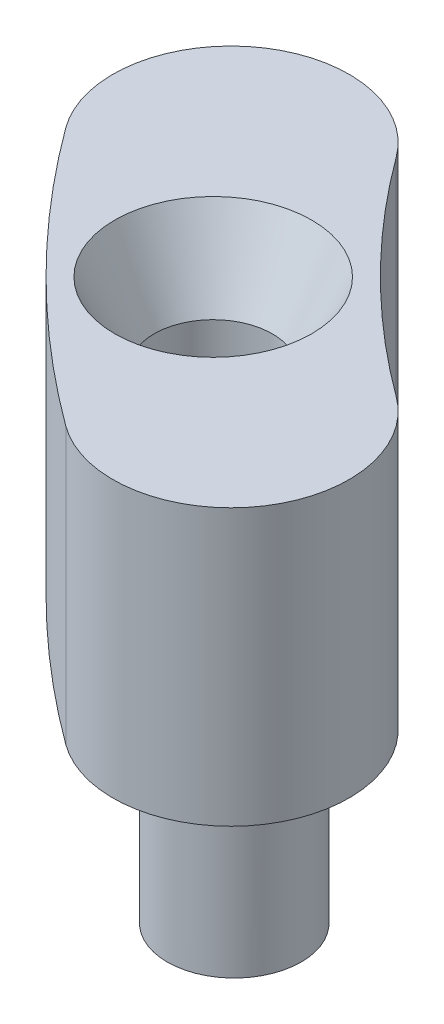
ISO-10303-21;
HEADER;
FILE_DESCRIPTION(('STEP AP214'),'2;1');
FILE_NAME('part.step','',(''),(''),'','','');
FILE_SCHEMA(('AUTOMOTIVE_DESIGN { 1 0 10303 214 1 1 1 1 }'));
ENDSEC;
DATA;
#1=APPLICATION_CONTEXT('core data for automotive mechanical design processes');
#2=APPLICATION_PROTOCOL_DEFINITION('international standard','automotive_design',2000,#1);
#3=PRODUCT_CONTEXT('',#1,'mechanical');
#4=PRODUCT('Part','Part','',(#3));
#5=PRODUCT_RELATED_PRODUCT_CATEGORY('part','',(#4));
#6=PRODUCT_DEFINITION_FORMATION('','',#4);
#7=PRODUCT_DEFINITION_CONTEXT('part definition',#1,'design');
#8=PRODUCT_DEFINITION('design','',#6,#7);
#9=PRODUCT_DEFINITION_SHAPE('','',#8);
#10=(LENGTH_UNIT() NAMED_UNIT(*) SI_UNIT(.MILLI.,.METRE.));
#11=(NAMED_UNIT(*) PLANE_ANGLE_UNIT() SI_UNIT($,.RADIAN.));
#12=(NAMED_UNIT(*) SI_UNIT($,.STERADIAN.) SOLID_ANGLE_UNIT());
#13=UNCERTAINTY_MEASURE_WITH_UNIT(LENGTH_MEASURE(1.E-05),#10,'distance_accuracy_value','');
#14=(GEOMETRIC_REPRESENTATION_CONTEXT(3) GLOBAL_UNCERTAINTY_ASSIGNED_CONTEXT((#13)) GLOBAL_UNIT_ASSIGNED_CONTEXT((#10,
#11,#12)) REPRESENTATION_CONTEXT('',''));
#15=CARTESIAN_POINT('',(0.,0.,0.));
#16=DIRECTION('',(0.,0.,1.));
#17=DIRECTION('',(1.,0.,0.));
#18=AXIS2_PLACEMENT_3D('',#15,#16,#17);
#19=CARTESIAN_POINT('',(-11.0867806011601,7.,8.13300657209492));
#20=DIRECTION('',(0.,1.,0.));
#21=DIRECTION('',(0.,0.,1.));
#22=AXIS2_PLACEMENT_3D('',#19,#20,#21);
#23=PLANE('',#22);
#24=CARTESIAN_POINT('',(-19.4454364826302,7.,19.44543648263));
#25=DIRECTION('',(0.,1.,0.));
#26=DIRECTION('',(0.,0.,1.));
#27=AXIS2_PLACEMENT_3D('',#24,#25,#26);
#28=CIRCLE('',#27,2.5);
#29=CARTESIAN_POINT('',(-19.4454364826302,7.,21.94543648263));
#30=VERTEX_POINT('',#29);
#31=EDGE_CURVE('E135',#30,#30,#28,.T.);
#32=ORIENTED_EDGE('',*,*,#31,.F.);
#33=EDGE_LOOP('',(#32));
#34=FACE_BOUND('',#33,.T.);
#35=CARTESIAN_POINT('',(-22.1735612023203,7.,16.2660131441898));
#36=DIRECTION('',(0.,1.,0.));
#37=DIRECTION('',(0.,0.,1.));
#38=AXIS2_PLACEMENT_3D('',#35,#36,#37);
#39=CIRCLE('',#38,3.);
#40=CARTESIAN_POINT('',(-19.7546272529763,7.,14.4915389830055));
#41=VERTEX_POINT('',#40);
#42=CARTESIAN_POINT('',(-24.5924951516643,7.,18.0404873053742));
#43=VERTEX_POINT('',#42);
#44=EDGE_CURVE('E96',#41,#43,#39,.T.);
#45=ORIENTED_EDGE('',*,*,#44,.T.);
#46=CARTESIAN_POINT('',(0.,7.,0.));
#47=DIRECTION('',(0.,1.,0.));
#48=DIRECTION('',(0.,0.,1.));
#49=AXIS2_PLACEMENT_3D('',#46,#47,#48);
#50=CIRCLE('',#49,30.5);
#51=CARTESIAN_POINT('',(-18.0404873053744,7.,24.5924951516641));
#52=VERTEX_POINT('',#51);
#53=EDGE_CURVE('E92',#43,#52,#50,.T.);
#54=ORIENTED_EDGE('',*,*,#53,.T.);
#55=CARTESIAN_POINT('',(-16.2660131441901,7.,22.1735612023201));
#56=DIRECTION('',(0.,1.,0.));
#57=DIRECTION('',(0.,0.,-1.));
#58=AXIS2_PLACEMENT_3D('',#55,#56,#57);
#59=CIRCLE('',#58,3.);
#60=CARTESIAN_POINT('',(-14.4915389830057,7.,19.7546272529761));
#61=VERTEX_POINT('',#60);
#62=EDGE_CURVE('E94',#52,#61,#59,.T.);
#63=ORIENTED_EDGE('',*,*,#62,.T.);
#64=CARTESIAN_POINT('',(0.,7.,0.));
#65=DIRECTION('',(0.,-1.,0.));
#66=DIRECTION('',(0.,0.,1.));
#67=AXIS2_PLACEMENT_3D('',#64,#65,#66);
#68=CIRCLE('',#67,24.5);
#69=EDGE_CURVE('E61',#61,#41,#68,.T.);
#70=ORIENTED_EDGE('',*,*,#69,.T.);
#71=EDGE_LOOP('',(#45,#54,#63,#70));
#72=FACE_BOUND('',#71,.T.);
#73=ADVANCED_FACE('F43',(#34,#72),#23,.T.);
#74=CARTESIAN_POINT('',(-11.0867806011601,0.,8.13300657209492));
#75=DIRECTION('',(0.,1.,0.));
#76=DIRECTION('',(0.,0.,1.));
#77=AXIS2_PLACEMENT_3D('',#74,#75,#76);
#78=PLANE('',#77);
#79=CARTESIAN_POINT('',(-22.3881767547989,0.,15.9693312820507));
#80=DIRECTION('',(0.,1.,0.));
#81=DIRECTION('',(0.,0.,1.));
#82=AXIS2_PLACEMENT_3D('',#79,#80,#81);
#83=CIRCLE('',#82,2.);
#84=CARTESIAN_POINT('',(-22.3881767547989,0.,17.9693312820507));
#85=VERTEX_POINT('',#84);
#86=EDGE_CURVE('E11',#85,#85,#83,.F.);
#87=ORIENTED_EDGE('',*,*,#86,.F.);
#88=EDGE_LOOP('',(#87));
#89=FACE_BOUND('',#88,.T.);
#90=CARTESIAN_POINT('',(-15.9693312820509,0.,22.3881767547987));
#91=DIRECTION('',(0.,1.,0.));
#92=DIRECTION('',(0.,0.,1.));
#93=AXIS2_PLACEMENT_3D('',#90,#91,#92);
#94=CIRCLE('',#93,1.7);
#95=CARTESIAN_POINT('',(-15.9693312820509,0.,24.0881767547987));
#96=VERTEX_POINT('',#95);
#97=EDGE_CURVE('E53',#96,#96,#94,.F.);
#98=ORIENTED_EDGE('',*,*,#97,.F.);
#99=EDGE_LOOP('',(#98));
#100=FACE_BOUND('',#99,.T.);
#101=CARTESIAN_POINT('',(-22.1735612023203,0.,16.2660131441898));
#102=DIRECTION('',(0.,1.,0.));
#103=DIRECTION('',(0.,0.,1.));
#104=AXIS2_PLACEMENT_3D('',#101,#102,#103);
#105=CIRCLE('',#104,3.);
#106=CARTESIAN_POINT('',(-19.7546272529763,0.,14.4915389830055));
#107=VERTEX_POINT('',#106);
#108=CARTESIAN_POINT('',(-24.5924951516643,0.,18.0404873053742));
#109=VERTEX_POINT('',#108);
#110=EDGE_CURVE('E115',#107,#109,#105,.T.);
#111=ORIENTED_EDGE('',*,*,#110,.F.);
#112=CARTESIAN_POINT('',(0.,0.,0.));
#113=DIRECTION('',(0.,-1.,0.));
#114=DIRECTION('',(0.,0.,1.));
#115=AXIS2_PLACEMENT_3D('',#112,#113,#114);
#116=CIRCLE('',#115,24.5);
#117=CARTESIAN_POINT('',(-14.4915389830057,0.,19.7546272529761));
#118=VERTEX_POINT('',#117);
#119=EDGE_CURVE('E84',#118,#107,#116,.T.);
#120=ORIENTED_EDGE('',*,*,#119,.F.);
#121=CARTESIAN_POINT('',(-16.2660131441901,0.,22.1735612023201));
#122=DIRECTION('',(0.,1.,0.));
#123=DIRECTION('',(0.,0.,-1.));
#124=AXIS2_PLACEMENT_3D('',#121,#122,#123);
#125=CIRCLE('',#124,3.);
#126=CARTESIAN_POINT('',(-18.0404873053744,0.,24.5924951516641));
#127=VERTEX_POINT('',#126);
#128=EDGE_CURVE('E78',#127,#118,#125,.T.);
#129=ORIENTED_EDGE('',*,*,#128,.F.);
#130=CARTESIAN_POINT('',(0.,0.,0.));
#131=DIRECTION('',(0.,1.,0.));
#132=DIRECTION('',(0.,0.,1.));
#133=AXIS2_PLACEMENT_3D('',#130,#131,#132);
#134=CIRCLE('',#133,30.5);
#135=EDGE_CURVE('E102',#109,#127,#134,.T.);
#136=ORIENTED_EDGE('',*,*,#135,.F.);
#137=EDGE_LOOP('',(#111,#120,#129,#136));
#138=FACE_BOUND('',#137,.T.);
#139=CARTESIAN_POINT('',(-19.4454364826302,0.,19.44543648263));
#140=DIRECTION('',(0.,1.,0.));
#141=DIRECTION('',(0.,0.,1.));
#142=AXIS2_PLACEMENT_3D('',#139,#140,#141);
#143=CIRCLE('',#142,1.5);
#144=CARTESIAN_POINT('',(-19.4454364826302,0.,20.94543648263));
#145=VERTEX_POINT('',#144);
#146=EDGE_CURVE('E119',#145,#145,#143,.T.);
#147=ORIENTED_EDGE('',*,*,#146,.T.);
#148=EDGE_LOOP('',(#147));
#149=FACE_BOUND('',#148,.T.);
#150=ADVANCED_FACE('F142',(#89,#100,#138,#149),#78,.F.);
#151=CARTESIAN_POINT('',(-22.1735612023203,7.,16.2660131441898));
#152=DIRECTION('',(0.,-1.,0.));
#153=DIRECTION('',(0.,0.,-1.));
#154=AXIS2_PLACEMENT_3D('',#151,#152,#153);
#155=CYLINDRICAL_SURFACE('',#154,3.);
#156=ORIENTED_EDGE('',*,*,#110,.T.);
#157=DIRECTION('',(0.,-1.,0.));
#158=VECTOR('',#157,1.);
#159=CARTESIAN_POINT('',(-24.5924951516643,7.,18.0404873053742));
#160=LINE('',#159,#158);
#161=EDGE_CURVE('E104',#43,#109,#160,.T.);
#162=ORIENTED_EDGE('',*,*,#161,.F.);
#163=ORIENTED_EDGE('',*,*,#44,.F.);
#164=DIRECTION('',(0.,-1.,0.));
#165=VECTOR('',#164,1.);
#166=CARTESIAN_POINT('',(-19.7546272529763,7.,14.4915389830055));
#167=LINE('',#166,#165);
#168=EDGE_CURVE('E111',#41,#107,#167,.T.);
#169=ORIENTED_EDGE('',*,*,#168,.T.);
#170=EDGE_LOOP('',(#156,#162,#163,#169));
#171=FACE_BOUND('',#170,.T.);
#172=ADVANCED_FACE('F45',(#171),#155,.T.);
#173=CARTESIAN_POINT('',(0.,7.,0.));
#174=DIRECTION('',(0.,-1.,0.));
#175=DIRECTION('',(0.,0.,-1.));
#176=AXIS2_PLACEMENT_3D('',#173,#174,#175);
#177=CYLINDRICAL_SURFACE('',#176,30.5);
#178=ORIENTED_EDGE('',*,*,#135,.T.);
#179=DIRECTION('',(0.,-1.,0.));
#180=VECTOR('',#179,1.);
#181=CARTESIAN_POINT('',(-18.0404873053744,7.,24.5924951516641));
#182=LINE('',#181,#180);
#183=EDGE_CURVE('E100',#52,#127,#182,.T.);
#184=ORIENTED_EDGE('',*,*,#183,.F.);
#185=ORIENTED_EDGE('',*,*,#53,.F.);
#186=ORIENTED_EDGE('',*,*,#161,.T.);
#187=EDGE_LOOP('',(#178,#184,#185,#186));
#188=FACE_BOUND('',#187,.T.);
#189=ADVANCED_FACE('F101',(#188),#177,.T.);
#190=CARTESIAN_POINT('',(-16.2660131441901,7.,22.1735612023201));
#191=DIRECTION('',(0.,-1.,0.));
#192=DIRECTION('',(0.,0.,-1.));
#193=AXIS2_PLACEMENT_3D('',#190,#191,#192);
#194=CYLINDRICAL_SURFACE('',#193,3.);
#195=ORIENTED_EDGE('',*,*,#128,.T.);
#196=DIRECTION('',(0.,-1.,0.));
#197=VECTOR('',#196,1.);
#198=CARTESIAN_POINT('',(-14.4915389830057,7.,19.7546272529761));
#199=LINE('',#198,#197);
#200=EDGE_CURVE('E105',#61,#118,#199,.T.);
#201=ORIENTED_EDGE('',*,*,#200,.F.);
#202=ORIENTED_EDGE('',*,*,#62,.F.);
#203=ORIENTED_EDGE('',*,*,#183,.T.);
#204=EDGE_LOOP('',(#195,#201,#202,#203));
#205=FACE_BOUND('',#204,.T.);
#206=ADVANCED_FACE('F107',(#205),#194,.T.);
#207=CARTESIAN_POINT('',(0.,7.,0.));
#208=DIRECTION('',(0.,-1.,0.));
#209=DIRECTION('',(0.,0.,-1.));
#210=AXIS2_PLACEMENT_3D('',#207,#208,#209);
#211=CYLINDRICAL_SURFACE('',#210,24.5);
#212=ORIENTED_EDGE('',*,*,#119,.T.);
#213=ORIENTED_EDGE('',*,*,#168,.F.);
#214=ORIENTED_EDGE('',*,*,#69,.F.);
#215=ORIENTED_EDGE('',*,*,#200,.T.);
#216=EDGE_LOOP('',(#212,#213,#214,#215));
#217=FACE_BOUND('',#216,.T.);
#218=ADVANCED_FACE('F193',(#217),#211,.F.);
#219=CARTESIAN_POINT('',(-19.4454364826302,7.,19.44543648263));
#220=DIRECTION('',(0.,-1.,0.));
#221=DIRECTION('',(0.,0.,-1.));
#222=AXIS2_PLACEMENT_3D('',#219,#220,#221);
#223=CYLINDRICAL_SURFACE('',#222,1.5);
#224=CARTESIAN_POINT('',(-19.4454364826302,5.,19.44543648263));
#225=DIRECTION('',(0.,1.,0.));
#226=DIRECTION('',(0.,0.,1.));
#227=AXIS2_PLACEMENT_3D('',#224,#225,#226);
#228=CIRCLE('',#227,1.5);
#229=CARTESIAN_POINT('',(-19.4454364826302,5.,20.94543648263));
#230=VERTEX_POINT('',#229);
#231=EDGE_CURVE('E132',#230,#230,#228,.F.);
#232=ORIENTED_EDGE('',*,*,#231,.F.);
#233=EDGE_LOOP('',(#232));
#234=FACE_BOUND('',#233,.T.);
#235=ORIENTED_EDGE('',*,*,#146,.F.);
#236=EDGE_LOOP('',(#235));
#237=FACE_BOUND('',#236,.T.);
#238=ADVANCED_FACE('F190',(#234,#237),#223,.F.);
#239=CARTESIAN_POINT('',(-19.4454364826302,7.,19.44543648263));
#240=DIRECTION('',(0.,1.,0.));
#241=DIRECTION('',(0.,0.,1.));
#242=AXIS2_PLACEMENT_3D('',#239,#240,#241);
#243=CONICAL_SURFACE('',#242,2.5,0.463647609000805);
#244=ORIENTED_EDGE('',*,*,#231,.T.);
#245=EDGE_LOOP('',(#244));
#246=FACE_BOUND('',#245,.T.);
#247=ORIENTED_EDGE('',*,*,#31,.T.);
#248=EDGE_LOOP('',(#247));
#249=FACE_BOUND('',#248,.T.);
#250=ADVANCED_FACE('F216',(#246,#249),#243,.F.);
#251=CARTESIAN_POINT('',(-15.9693312820509,-4.,22.3881767547987));
#252=DIRECTION('',(0.,1.,0.));
#253=DIRECTION('',(0.,0.,1.));
#254=AXIS2_PLACEMENT_3D('',#251,#252,#253);
#255=CYLINDRICAL_SURFACE('',#254,1.7);
#256=CARTESIAN_POINT('',(-15.9693312820509,-4.,22.3881767547987));
#257=DIRECTION('',(0.,-1.,0.));
#258=DIRECTION('',(0.,0.,-1.));
#259=AXIS2_PLACEMENT_3D('',#256,#257,#258);
#260=CIRCLE('',#259,1.7);
#261=CARTESIAN_POINT('',(-15.9693312820509,-4.,20.6881767547987));
#262=VERTEX_POINT('',#261);
#263=EDGE_CURVE('E159',#262,#262,#260,.T.);
#264=ORIENTED_EDGE('',*,*,#263,.F.);
#265=EDGE_LOOP('',(#264));
#266=FACE_BOUND('',#265,.T.);
#267=ORIENTED_EDGE('',*,*,#97,.T.);
#268=EDGE_LOOP('',(#267));
#269=FACE_BOUND('',#268,.T.);
#270=ADVANCED_FACE('F140',(#266,#269),#255,.T.);
#271=CARTESIAN_POINT('',(-15.9693312820509,-4.,22.3881767547987));
#272=DIRECTION('',(0.,-1.,0.));
#273=DIRECTION('',(0.,0.,-1.));
#274=AXIS2_PLACEMENT_3D('',#271,#272,#273);
#275=PLANE('',#274);
#276=ORIENTED_EDGE('',*,*,#263,.T.);
#277=EDGE_LOOP('',(#276));
#278=FACE_BOUND('',#277,.T.);
#279=ADVANCED_FACE('F173',(#278),#275,.T.);
#280=CARTESIAN_POINT('',(-22.3881767547989,-4.,15.9693312820507));
#281=DIRECTION('',(0.,1.,0.));
#282=DIRECTION('',(0.,0.,1.));
#283=AXIS2_PLACEMENT_3D('',#280,#281,#282);
#284=CYLINDRICAL_SURFACE('',#283,2.);
#285=CARTESIAN_POINT('',(-22.3881767547989,-4.,15.9693312820507));
#286=DIRECTION('',(0.,-1.,0.));
#287=DIRECTION('',(0.,0.,-1.));
#288=AXIS2_PLACEMENT_3D('',#285,#286,#287);
#289=CIRCLE('',#288,2.);
#290=CARTESIAN_POINT('',(-22.3881767547989,-4.,13.9693312820507));
#291=VERTEX_POINT('',#290);
#292=EDGE_CURVE('E163',#291,#291,#289,.T.);
#293=ORIENTED_EDGE('',*,*,#292,.F.);
#294=EDGE_LOOP('',(#293));
#295=FACE_BOUND('',#294,.T.);
#296=ORIENTED_EDGE('',*,*,#86,.T.);
#297=EDGE_LOOP('',(#296));
#298=FACE_BOUND('',#297,.T.);
#299=ADVANCED_FACE('F170',(#295,#298),#284,.T.);
#300=CARTESIAN_POINT('',(-22.3881767547989,-4.,15.9693312820507));
#301=DIRECTION('',(0.,-1.,0.));
#302=DIRECTION('',(0.,0.,-1.));
#303=AXIS2_PLACEMENT_3D('',#300,#301,#302);
#304=PLANE('',#303);
#305=ORIENTED_EDGE('',*,*,#292,.T.);
#306=EDGE_LOOP('',(#305));
#307=FACE_BOUND('',#306,.T.);
#308=ADVANCED_FACE('F168',(#307),#304,.T.);
#309=CLOSED_SHELL('',(#73,#150,#172,#189,#206,#218,#238,#250,#270,#279,#299,#308));
#310=MANIFOLD_SOLID_BREP('B2',#309);
#311=ADVANCED_BREP_SHAPE_REPRESENTATION('',(#18,#310),#14);
#312=SHAPE_DEFINITION_REPRESENTATION(#9,#311);
ENDSEC;
END-ISO-10303-21;
